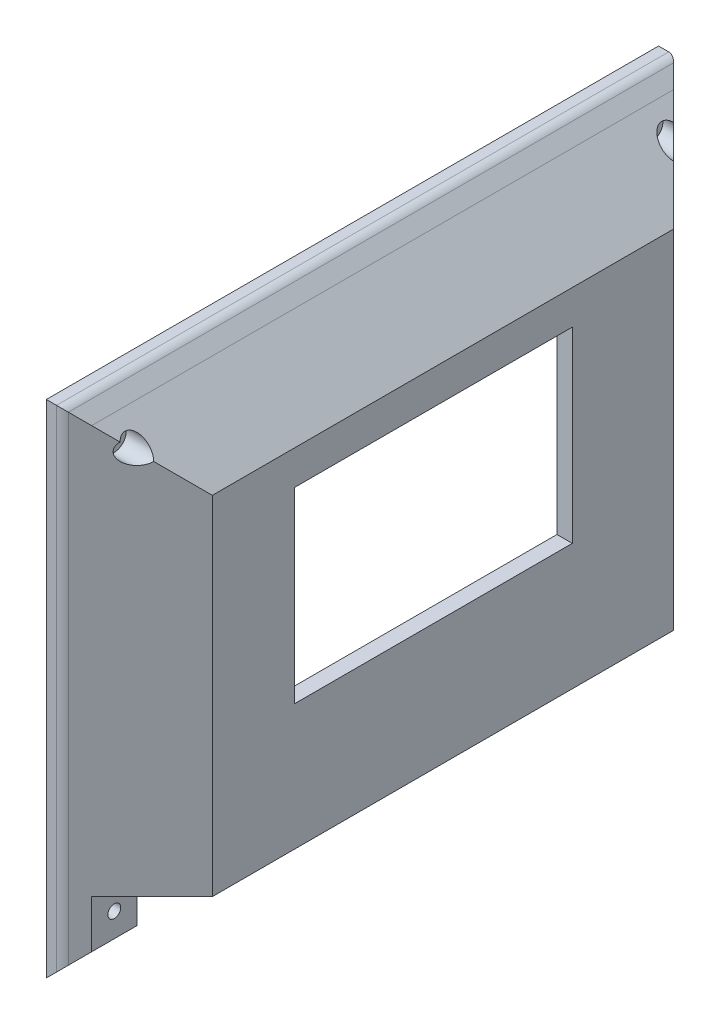
ISO-10303-21;
HEADER;
FILE_DESCRIPTION(('STEP AP214'),'2;1');
FILE_NAME('part.step','',(''),(''),'','','');
FILE_SCHEMA(('AUTOMOTIVE_DESIGN { 1 0 10303 214 1 1 1 1 }'));
ENDSEC;
DATA;
#1=APPLICATION_CONTEXT('core data for automotive mechanical design processes');
#2=APPLICATION_PROTOCOL_DEFINITION('international standard','automotive_design',2000,#1);
#3=PRODUCT_CONTEXT('',#1,'mechanical');
#4=PRODUCT('Part','Part','',(#3));
#5=PRODUCT_RELATED_PRODUCT_CATEGORY('part','',(#4));
#6=PRODUCT_DEFINITION_FORMATION('','',#4);
#7=PRODUCT_DEFINITION_CONTEXT('part definition',#1,'design');
#8=PRODUCT_DEFINITION('design','',#6,#7);
#9=PRODUCT_DEFINITION_SHAPE('','',#8);
#10=(LENGTH_UNIT() NAMED_UNIT(*) SI_UNIT(.MILLI.,.METRE.));
#11=(NAMED_UNIT(*) PLANE_ANGLE_UNIT() SI_UNIT($,.RADIAN.));
#12=(NAMED_UNIT(*) SI_UNIT($,.STERADIAN.) SOLID_ANGLE_UNIT());
#13=UNCERTAINTY_MEASURE_WITH_UNIT(LENGTH_MEASURE(1.E-05),#10,'distance_accuracy_value','');
#14=(GEOMETRIC_REPRESENTATION_CONTEXT(3) GLOBAL_UNCERTAINTY_ASSIGNED_CONTEXT((#13)) GLOBAL_UNIT_ASSIGNED_CONTEXT((#10,
#11,#12)) REPRESENTATION_CONTEXT('',''));
#15=CARTESIAN_POINT('',(0.,0.,0.));
#16=DIRECTION('',(0.,0.,1.));
#17=DIRECTION('',(1.,0.,0.));
#18=AXIS2_PLACEMENT_3D('',#15,#16,#17);
#19=CARTESIAN_POINT('',(6.35,0.,0.));
#20=DIRECTION('',(-1.,0.,0.));
#21=DIRECTION('',(0.,0.,1.));
#22=AXIS2_PLACEMENT_3D('',#19,#20,#21);
#23=PLANE('',#22);
#24=CARTESIAN_POINT('',(6.35,-34.97,-56.4625));
#25=DIRECTION('',(1.,0.,0.));
#26=DIRECTION('',(0.,0.,-1.));
#27=AXIS2_PLACEMENT_3D('',#24,#25,#26);
#28=CIRCLE('',#27,1.35);
#29=CARTESIAN_POINT('',(6.35,-34.97,-57.8125));
#30=VERTEX_POINT('',#29);
#31=EDGE_CURVE('E349',#30,#30,#28,.T.);
#32=ORIENTED_EDGE('',*,*,#31,.F.);
#33=EDGE_LOOP('',(#32));
#34=FACE_BOUND('',#33,.T.);
#35=DIRECTION('',(0.,-1.,0.));
#36=VECTOR('',#35,1.);
#37=CARTESIAN_POINT('',(6.35,46.35,-51.7));
#38=LINE('',#37,#36);
#39=CARTESIAN_POINT('',(6.35,-29.94,-51.7));
#40=VERTEX_POINT('',#39);
#41=CARTESIAN_POINT('',(6.35,-40.,-51.7));
#42=VERTEX_POINT('',#41);
#43=EDGE_CURVE('E454',#40,#42,#38,.T.);
#44=ORIENTED_EDGE('',*,*,#43,.T.);
#45=DIRECTION('',(0.,0.,-1.));
#46=VECTOR('',#45,1.);
#47=CARTESIAN_POINT('',(6.35,-40.,0.));
#48=LINE('',#47,#46);
#49=CARTESIAN_POINT('',(6.35,-40.,-61.225));
#50=VERTEX_POINT('',#49);
#51=EDGE_CURVE('E280',#42,#50,#48,.T.);
#52=ORIENTED_EDGE('',*,*,#51,.T.);
#53=DIRECTION('',(0.,1.,0.));
#54=VECTOR('',#53,1.);
#55=CARTESIAN_POINT('',(6.35,0.,-61.225));
#56=LINE('',#55,#54);
#57=CARTESIAN_POINT('',(6.35,-29.94,-61.225));
#58=VERTEX_POINT('',#57);
#59=EDGE_CURVE('E504',#50,#58,#56,.T.);
#60=ORIENTED_EDGE('',*,*,#59,.T.);
#61=DIRECTION('',(0.,0.,-1.));
#62=VECTOR('',#61,1.);
#63=CARTESIAN_POINT('',(6.35,-29.94,-51.7));
#64=LINE('',#63,#62);
#65=EDGE_CURVE('E381',#40,#58,#64,.T.);
#66=ORIENTED_EDGE('',*,*,#65,.F.);
#67=EDGE_LOOP('',(#44,#52,#60,#66));
#68=FACE_BOUND('',#67,.T.);
#69=ADVANCED_FACE('F49',(#34,#68),#23,.F.);
#70=CARTESIAN_POINT('',(6.35,-34.97,56.4625));
#71=DIRECTION('',(1.,0.,0.));
#72=DIRECTION('',(0.,0.,-1.));
#73=AXIS2_PLACEMENT_3D('',#70,#71,#72);
#74=CIRCLE('',#73,1.35);
#75=CARTESIAN_POINT('',(6.35,-34.97,55.1125));
#76=VERTEX_POINT('',#75);
#77=EDGE_CURVE('E314',#76,#76,#74,.T.);
#78=ORIENTED_EDGE('',*,*,#77,.F.);
#79=EDGE_LOOP('',(#78));
#80=FACE_BOUND('',#79,.T.);
#81=DIRECTION('',(0.,-1.,0.));
#82=VECTOR('',#81,1.);
#83=CARTESIAN_POINT('',(6.35,0.,61.225));
#84=LINE('',#83,#82);
#85=CARTESIAN_POINT('',(6.35,-29.94,61.225));
#86=VERTEX_POINT('',#85);
#87=CARTESIAN_POINT('',(6.35,-40.,61.225));
#88=VERTEX_POINT('',#87);
#89=EDGE_CURVE('E496',#86,#88,#84,.T.);
#90=ORIENTED_EDGE('',*,*,#89,.T.);
#91=DIRECTION('',(0.,0.,-1.));
#92=VECTOR('',#91,1.);
#93=CARTESIAN_POINT('',(6.35,-40.,0.));
#94=LINE('',#93,#92);
#95=CARTESIAN_POINT('',(6.35,-40.,51.7));
#96=VERTEX_POINT('',#95);
#97=EDGE_CURVE('E294',#88,#96,#94,.T.);
#98=ORIENTED_EDGE('',*,*,#97,.T.);
#99=DIRECTION('',(0.,1.,0.));
#100=VECTOR('',#99,1.);
#101=CARTESIAN_POINT('',(6.35,-46.35,51.7));
#102=LINE('',#101,#100);
#103=CARTESIAN_POINT('',(6.35,-29.94,51.7));
#104=VERTEX_POINT('',#103);
#105=EDGE_CURVE('E451',#96,#104,#102,.T.);
#106=ORIENTED_EDGE('',*,*,#105,.T.);
#107=DIRECTION('',(0.,0.,-1.));
#108=VECTOR('',#107,1.);
#109=CARTESIAN_POINT('',(6.35,-29.94,61.225));
#110=LINE('',#109,#108);
#111=EDGE_CURVE('E318',#86,#104,#110,.T.);
#112=ORIENTED_EDGE('',*,*,#111,.F.);
#113=EDGE_LOOP('',(#90,#98,#106,#112));
#114=FACE_BOUND('',#113,.T.);
#115=ADVANCED_FACE('F535',(#80,#114),#23,.F.);
#116=CARTESIAN_POINT('',(6.35,-46.35,51.7));
#117=DIRECTION('',(0.,0.,1.));
#118=DIRECTION('',(0.,-1.,0.));
#119=AXIS2_PLACEMENT_3D('',#116,#117,#118);
#120=PLANE('',#119);
#121=ORIENTED_EDGE('',*,*,#105,.F.);
#122=DIRECTION('',(0.707106781186548,0.707106781186547,0.));
#123=VECTOR('',#122,1.);
#124=CARTESIAN_POINT('',(6.35,-40.,51.7));
#125=LINE('',#124,#123);
#126=CARTESIAN_POINT('',(0.,-46.35,51.7));
#127=VERTEX_POINT('',#126);
#128=EDGE_CURVE('E298',#96,#127,#125,.F.);
#129=ORIENTED_EDGE('',*,*,#128,.T.);
#130=DIRECTION('',(0.,1.,0.));
#131=VECTOR('',#130,1.);
#132=CARTESIAN_POINT('',(0.,-46.35,51.7));
#133=LINE('',#132,#131);
#134=CARTESIAN_POINT('',(0.,-29.94,51.7));
#135=VERTEX_POINT('',#134);
#136=EDGE_CURVE('E460',#127,#135,#133,.T.);
#137=ORIENTED_EDGE('',*,*,#136,.T.);
#138=DIRECTION('',(-1.,0.,0.));
#139=VECTOR('',#138,1.);
#140=CARTESIAN_POINT('',(6.35,-29.94,51.7));
#141=LINE('',#140,#139);
#142=EDGE_CURVE('E369',#104,#135,#141,.T.);
#143=ORIENTED_EDGE('',*,*,#142,.F.);
#144=EDGE_LOOP('',(#121,#129,#137,#143));
#145=FACE_BOUND('',#144,.T.);
#146=ADVANCED_FACE('F539',(#145),#120,.F.);
#147=CARTESIAN_POINT('',(6.35,46.35,-51.7));
#148=DIRECTION('',(0.,0.,-1.));
#149=DIRECTION('',(0.,1.,0.));
#150=AXIS2_PLACEMENT_3D('',#147,#148,#149);
#151=PLANE('',#150);
#152=DIRECTION('',(0.,-1.,0.));
#153=VECTOR('',#152,1.);
#154=CARTESIAN_POINT('',(0.,46.35,-51.7));
#155=LINE('',#154,#153);
#156=CARTESIAN_POINT('',(0.,-29.94,-51.7));
#157=VERTEX_POINT('',#156);
#158=CARTESIAN_POINT('',(0.,-46.35,-51.7));
#159=VERTEX_POINT('',#158);
#160=EDGE_CURVE('E469',#157,#159,#155,.T.);
#161=ORIENTED_EDGE('',*,*,#160,.T.);
#162=DIRECTION('',(-0.707106781186548,-0.707106781186547,0.));
#163=VECTOR('',#162,1.);
#164=CARTESIAN_POINT('',(6.35,-40.,-51.7));
#165=LINE('',#164,#163);
#166=EDGE_CURVE('E291',#159,#42,#165,.F.);
#167=ORIENTED_EDGE('',*,*,#166,.T.);
#168=ORIENTED_EDGE('',*,*,#43,.F.);
#169=DIRECTION('',(1.,0.,0.));
#170=VECTOR('',#169,1.);
#171=CARTESIAN_POINT('',(0.,-29.94,-51.7));
#172=LINE('',#171,#170);
#173=EDGE_CURVE('E377',#157,#40,#172,.T.);
#174=ORIENTED_EDGE('',*,*,#173,.F.);
#175=EDGE_LOOP('',(#161,#167,#168,#174));
#176=FACE_BOUND('',#175,.T.);
#177=ADVANCED_FACE('F569',(#176),#151,.F.);
#178=CARTESIAN_POINT('',(6.35,-46.35,-64.4));
#179=DIRECTION('',(0.,0.,1.));
#180=DIRECTION('',(1.,0.,0.));
#181=AXIS2_PLACEMENT_3D('',#178,#179,#180);
#182=PLANE('',#181);
#183=DIRECTION('',(-1.,0.,0.));
#184=VECTOR('',#183,1.);
#185=CARTESIAN_POINT('',(6.35,59.05,-64.4));
#186=LINE('',#185,#184);
#187=CARTESIAN_POINT('',(2.13946609406726,59.05,-64.4));
#188=VERTEX_POINT('',#187);
#189=CARTESIAN_POINT('',(0.,59.05,-64.4));
#190=VERTEX_POINT('',#189);
#191=EDGE_CURVE('E493',#188,#190,#186,.T.);
#192=ORIENTED_EDGE('',*,*,#191,.F.);
#193=DIRECTION('',(0.,1.,0.));
#194=VECTOR('',#193,1.);
#195=CARTESIAN_POINT('',(2.13946609406726,-43.175,-64.4));
#196=LINE('',#195,#194);
#197=CARTESIAN_POINT('',(2.13946609406726,-44.2105339059327,-64.4));
#198=VERTEX_POINT('',#197);
#199=EDGE_CURVE('E334',#188,#198,#196,.F.);
#200=ORIENTED_EDGE('',*,*,#199,.T.);
#201=DIRECTION('',(0.707106781186548,0.707106781186547,0.));
#202=VECTOR('',#201,1.);
#203=CARTESIAN_POINT('',(6.35,-40.,-64.4));
#204=LINE('',#203,#202);
#205=CARTESIAN_POINT('',(0.,-46.35,-64.4));
#206=VERTEX_POINT('',#205);
#207=EDGE_CURVE('E288',#198,#206,#204,.F.);
#208=ORIENTED_EDGE('',*,*,#207,.T.);
#209=DIRECTION('',(0.,1.,0.));
#210=VECTOR('',#209,1.);
#211=CARTESIAN_POINT('',(0.,-46.35,-64.4));
#212=LINE('',#211,#210);
#213=EDGE_CURVE('E477',#206,#190,#212,.T.);
#214=ORIENTED_EDGE('',*,*,#213,.T.);
#215=EDGE_LOOP('',(#192,#200,#208,#214));
#216=FACE_BOUND('',#215,.T.);
#217=ADVANCED_FACE('F613',(#216),#182,.F.);
#218=CARTESIAN_POINT('',(6.35,59.05,64.4));
#219=DIRECTION('',(0.,-1.,0.));
#220=DIRECTION('',(0.,0.,-1.));
#221=AXIS2_PLACEMENT_3D('',#218,#219,#220);
#222=PLANE('',#221);
#223=DIRECTION('',(-1.,0.,0.));
#224=VECTOR('',#223,1.);
#225=CARTESIAN_POINT('',(6.35,59.05,64.4));
#226=LINE('',#225,#224);
#227=CARTESIAN_POINT('',(2.13946609406726,59.05,64.4));
#228=VERTEX_POINT('',#227);
#229=CARTESIAN_POINT('',(0.,59.05,64.4));
#230=VERTEX_POINT('',#229);
#231=EDGE_CURVE('E459',#228,#230,#226,.T.);
#232=ORIENTED_EDGE('',*,*,#231,.F.);
#233=DIRECTION('',(0.,0.,1.));
#234=VECTOR('',#233,1.);
#235=CARTESIAN_POINT('',(2.13946609406726,59.05,-64.4));
#236=LINE('',#235,#234);
#237=EDGE_CURVE('E328',#228,#188,#236,.F.);
#238=ORIENTED_EDGE('',*,*,#237,.T.);
#239=ORIENTED_EDGE('',*,*,#191,.T.);
#240=DIRECTION('',(0.,0.,1.));
#241=VECTOR('',#240,1.);
#242=CARTESIAN_POINT('',(0.,59.05,64.4));
#243=LINE('',#242,#241);
#244=EDGE_CURVE('E481',#190,#230,#243,.T.);
#245=ORIENTED_EDGE('',*,*,#244,.T.);
#246=EDGE_LOOP('',(#232,#238,#239,#245));
#247=FACE_BOUND('',#246,.T.);
#248=ADVANCED_FACE('F609',(#247),#222,.F.);
#249=CARTESIAN_POINT('',(6.35,-46.35,64.4));
#250=DIRECTION('',(0.,0.,-1.));
#251=DIRECTION('',(-1.,0.,0.));
#252=AXIS2_PLACEMENT_3D('',#249,#250,#251);
#253=PLANE('',#252);
#254=DIRECTION('',(-0.707106781186548,-0.707106781186547,0.));
#255=VECTOR('',#254,1.);
#256=CARTESIAN_POINT('',(6.35,-40.,64.4));
#257=LINE('',#256,#255);
#258=CARTESIAN_POINT('',(0.,-46.35,64.4));
#259=VERTEX_POINT('',#258);
#260=CARTESIAN_POINT('',(2.13946609406726,-44.2105339059327,64.4));
#261=VERTEX_POINT('',#260);
#262=EDGE_CURVE('E301',#259,#261,#257,.F.);
#263=ORIENTED_EDGE('',*,*,#262,.T.);
#264=DIRECTION('',(0.,-1.,0.));
#265=VECTOR('',#264,1.);
#266=CARTESIAN_POINT('',(2.13946609406726,59.05,64.4));
#267=LINE('',#266,#265);
#268=EDGE_CURVE('E308',#261,#228,#267,.F.);
#269=ORIENTED_EDGE('',*,*,#268,.T.);
#270=ORIENTED_EDGE('',*,*,#231,.T.);
#271=DIRECTION('',(0.,-1.,0.));
#272=VECTOR('',#271,1.);
#273=CARTESIAN_POINT('',(0.,-46.35,64.4));
#274=LINE('',#273,#272);
#275=EDGE_CURVE('E485',#230,#259,#274,.T.);
#276=ORIENTED_EDGE('',*,*,#275,.T.);
#277=EDGE_LOOP('',(#263,#269,#270,#276));
#278=FACE_BOUND('',#277,.T.);
#279=ADVANCED_FACE('F605',(#278),#253,.F.);
#280=CARTESIAN_POINT('',(0.,0.,0.));
#281=DIRECTION('',(-1.,0.,0.));
#282=DIRECTION('',(0.,0.,1.));
#283=AXIS2_PLACEMENT_3D('',#280,#281,#282);
#284=PLANE('',#283);
#285=CARTESIAN_POINT('',(0.,51.1125,56.4625));
#286=DIRECTION('',(1.,0.,0.));
#287=DIRECTION('',(0.,0.,-1.));
#288=AXIS2_PLACEMENT_3D('',#285,#286,#287);
#289=CIRCLE('',#288,1.35);
#290=CARTESIAN_POINT('',(0.,51.1125,55.1125));
#291=VERTEX_POINT('',#290);
#292=EDGE_CURVE('E786',#291,#291,#289,.T.);
#293=ORIENTED_EDGE('',*,*,#292,.T.);
#294=EDGE_LOOP('',(#293));
#295=FACE_BOUND('',#294,.T.);
#296=CARTESIAN_POINT('',(0.,51.1125,-56.4625));
#297=DIRECTION('',(1.,0.,0.));
#298=DIRECTION('',(0.,0.,-1.));
#299=AXIS2_PLACEMENT_3D('',#296,#297,#298);
#300=CIRCLE('',#299,1.35);
#301=CARTESIAN_POINT('',(0.,51.1125,-57.8125));
#302=VERTEX_POINT('',#301);
#303=EDGE_CURVE('E798',#302,#302,#300,.T.);
#304=ORIENTED_EDGE('',*,*,#303,.T.);
#305=EDGE_LOOP('',(#304));
#306=FACE_BOUND('',#305,.T.);
#307=CARTESIAN_POINT('',(0.,-34.97,56.4625));
#308=DIRECTION('',(-1.,0.,0.));
#309=DIRECTION('',(0.,0.,1.));
#310=AXIS2_PLACEMENT_3D('',#307,#308,#309);
#311=CIRCLE('',#310,1.35);
#312=CARTESIAN_POINT('',(0.,-34.97,57.8125));
#313=VERTEX_POINT('',#312);
#314=EDGE_CURVE('E313',#313,#313,#311,.T.);
#315=ORIENTED_EDGE('',*,*,#314,.F.);
#316=EDGE_LOOP('',(#315));
#317=FACE_BOUND('',#316,.T.);
#318=CARTESIAN_POINT('',(0.,-34.97,-56.4625));
#319=DIRECTION('',(-1.,0.,0.));
#320=DIRECTION('',(0.,0.,1.));
#321=AXIS2_PLACEMENT_3D('',#318,#319,#320);
#322=CIRCLE('',#321,1.35);
#323=CARTESIAN_POINT('',(0.,-34.97,-55.1125));
#324=VERTEX_POINT('',#323);
#325=EDGE_CURVE('E309',#324,#324,#322,.T.);
#326=ORIENTED_EDGE('',*,*,#325,.F.);
#327=EDGE_LOOP('',(#326));
#328=FACE_BOUND('',#327,.T.);
#329=ORIENTED_EDGE('',*,*,#136,.F.);
#330=DIRECTION('',(0.,0.,-1.));
#331=VECTOR('',#330,1.);
#332=CARTESIAN_POINT('',(0.,-46.35,64.4));
#333=LINE('',#332,#331);
#334=EDGE_CURVE('E455',#259,#127,#333,.T.);
#335=ORIENTED_EDGE('',*,*,#334,.F.);
#336=ORIENTED_EDGE('',*,*,#275,.F.);
#337=ORIENTED_EDGE('',*,*,#244,.F.);
#338=ORIENTED_EDGE('',*,*,#213,.F.);
#339=DIRECTION('',(0.,0.,-1.));
#340=VECTOR('',#339,1.);
#341=CARTESIAN_POINT('',(0.,-46.35,-51.7));
#342=LINE('',#341,#340);
#343=EDGE_CURVE('E473',#159,#206,#342,.T.);
#344=ORIENTED_EDGE('',*,*,#343,.F.);
#345=ORIENTED_EDGE('',*,*,#160,.F.);
#346=CARTESIAN_POINT('',(0.,46.35,-51.7));
#347=VERTEX_POINT('',#346);
#348=EDGE_CURVE('E470',#347,#157,#155,.T.);
#349=ORIENTED_EDGE('',*,*,#348,.F.);
#350=DIRECTION('',(0.,0.,-1.));
#351=VECTOR('',#350,1.);
#352=CARTESIAN_POINT('',(0.,46.35,51.7));
#353=LINE('',#352,#351);
#354=CARTESIAN_POINT('',(0.,46.35,51.7));
#355=VERTEX_POINT('',#354);
#356=EDGE_CURVE('E464',#355,#347,#353,.T.);
#357=ORIENTED_EDGE('',*,*,#356,.F.);
#358=EDGE_CURVE('E465',#135,#355,#133,.T.);
#359=ORIENTED_EDGE('',*,*,#358,.F.);
#360=EDGE_LOOP('',(#329,#335,#336,#337,#338,#344,#345,#349,#357,#359));
#361=FACE_BOUND('',#360,.T.);
#362=ADVANCED_FACE('F571',(#295,#306,#317,#328,#361),#284,.T.);
#363=CARTESIAN_POINT('',(6.35,0.,61.225));
#364=DIRECTION('',(-0.707106781186546,0.,-0.707106781186549));
#365=DIRECTION('',(0.,-1.,0.));
#366=AXIS2_PLACEMENT_3D('',#363,#364,#365);
#367=PLANE('',#366);
#368=DIRECTION('',(-0.577350269189628,0.577350269189625,0.577350269189625));
#369=VECTOR('',#368,1.);
#370=CARTESIAN_POINT('',(24.975,37.2500000000001,42.6000000000001));
#371=LINE('',#370,#369);
#372=CARTESIAN_POINT('',(3.90723304703362,58.3177669529664,63.6677669529664));
#373=VERTEX_POINT('',#372);
#374=CARTESIAN_POINT('',(6.35,55.875,61.225));
#375=VERTEX_POINT('',#374);
#376=EDGE_CURVE('E511',#373,#375,#371,.F.);
#377=ORIENTED_EDGE('',*,*,#376,.F.);
#378=DIRECTION('',(0.,1.,0.));
#379=VECTOR('',#378,1.);
#380=CARTESIAN_POINT('',(3.90723304703362,-43.175,63.6677669529664));
#381=LINE('',#380,#379);
#382=CARTESIAN_POINT('',(3.90723304703362,-42.4427669529664,63.6677669529664));
#383=VERTEX_POINT('',#382);
#384=EDGE_CURVE('E322',#373,#383,#381,.F.);
#385=ORIENTED_EDGE('',*,*,#384,.T.);
#386=DIRECTION('',(0.577350269189627,0.577350269189626,-0.577350269189625));
#387=VECTOR('',#386,1.);
#388=CARTESIAN_POINT('',(19.6833333333334,-26.6666666666667,47.8916666666667));
#389=LINE('',#388,#387);
#390=EDGE_CURVE('E305',#383,#88,#389,.T.);
#391=ORIENTED_EDGE('',*,*,#390,.T.);
#392=ORIENTED_EDGE('',*,*,#89,.F.);
#393=DIRECTION('',(-0.707106781186547,0.,0.707106781186548));
#394=VECTOR('',#393,1.);
#395=CARTESIAN_POINT('',(19.05,-29.94,48.525));
#396=LINE('',#395,#394);
#397=CARTESIAN_POINT('',(19.05,-29.94,48.525));
#398=VERTEX_POINT('',#397);
#399=EDGE_CURVE('E396',#398,#86,#396,.T.);
#400=ORIENTED_EDGE('',*,*,#399,.F.);
#401=DIRECTION('',(0.,-1.,0.));
#402=VECTOR('',#401,1.);
#403=CARTESIAN_POINT('',(19.05,-5.43999999999999,48.525));
#404=LINE('',#403,#402);
#405=CARTESIAN_POINT('',(19.05,43.175,48.525));
#406=VERTEX_POINT('',#405);
#407=EDGE_CURVE('E261',#406,#398,#404,.T.);
#408=ORIENTED_EDGE('',*,*,#407,.F.);
#409=DIRECTION('',(0.577350269189627,-0.577350269189625,-0.577350269189625));
#410=VECTOR('',#409,1.);
#411=CARTESIAN_POINT('',(35.225,27.,32.35));
#412=LINE('',#411,#410);
#413=CARTESIAN_POINT('',(12.8802669529663,49.3447330470336,54.6947330470336));
#414=VERTEX_POINT('',#413);
#415=EDGE_CURVE('E252',#406,#414,#412,.F.);
#416=ORIENTED_EDGE('',*,*,#415,.T.);
#417=CARTESIAN_POINT('',(11.1125,51.1125,56.4625));
#418=DIRECTION('',(-0.707106781186546,0.,-0.707106781186549));
#419=DIRECTION('',(0.707106781186549,0.,-0.707106781186546));
#420=AXIS2_PLACEMENT_3D('',#417,#418,#419);
#421=ELLIPSE('',#420,3.53553390593275,2.5);
#422=CARTESIAN_POINT('',(9.34473304703358,52.8802669529664,58.2302669529664));
#423=VERTEX_POINT('',#422);
#424=EDGE_CURVE('E63',#423,#414,#421,.F.);
#425=ORIENTED_EDGE('',*,*,#424,.F.);
#426=EDGE_CURVE('E277',#423,#375,#412,.F.);
#427=ORIENTED_EDGE('',*,*,#426,.T.);
#428=EDGE_LOOP('',(#377,#385,#391,#392,#400,#408,#416,#425,#427));
#429=FACE_BOUND('',#428,.T.);
#430=ADVANCED_FACE('F528',(#429),#367,.F.);
#431=CARTESIAN_POINT('',(6.35,55.875,0.));
#432=DIRECTION('',(-0.707106781186546,-0.707106781186549,0.));
#433=DIRECTION('',(0.,0.,1.));
#434=AXIS2_PLACEMENT_3D('',#431,#432,#433);
#435=PLANE('',#434);
#436=DIRECTION('',(-0.577350269189628,0.577350269189625,-0.577350269189625));
#437=VECTOR('',#436,1.);
#438=CARTESIAN_POINT('',(26.7583333333334,35.4666666666667,-40.8166666666667));
#439=LINE('',#438,#437);
#440=CARTESIAN_POINT('',(3.90723304703362,58.3177669529664,-63.6677669529664));
#441=VERTEX_POINT('',#440);
#442=CARTESIAN_POINT('',(6.35,55.875,-61.225));
#443=VERTEX_POINT('',#442);
#444=EDGE_CURVE('E450',#441,#443,#439,.F.);
#445=ORIENTED_EDGE('',*,*,#444,.F.);
#446=DIRECTION('',(0.,0.,-1.));
#447=VECTOR('',#446,1.);
#448=CARTESIAN_POINT('',(3.90723304703362,58.3177669529664,64.4));
#449=LINE('',#448,#447);
#450=EDGE_CURVE('E331',#441,#373,#449,.F.);
#451=ORIENTED_EDGE('',*,*,#450,.T.);
#452=ORIENTED_EDGE('',*,*,#376,.T.);
#453=DIRECTION('',(0.,0.,1.));
#454=VECTOR('',#453,1.);
#455=CARTESIAN_POINT('',(6.35,55.875,0.));
#456=LINE('',#455,#454);
#457=EDGE_CURVE('E500',#443,#375,#456,.T.);
#458=ORIENTED_EDGE('',*,*,#457,.F.);
#459=EDGE_LOOP('',(#445,#451,#452,#458));
#460=FACE_BOUND('',#459,.T.);
#461=ADVANCED_FACE('F628',(#460),#435,.F.);
#462=CARTESIAN_POINT('',(6.35,0.,-61.225));
#463=DIRECTION('',(-0.707106781186546,0.,0.707106781186549));
#464=DIRECTION('',(0.,1.,0.));
#465=AXIS2_PLACEMENT_3D('',#462,#463,#464);
#466=PLANE('',#465);
#467=DIRECTION('',(0.577350269189627,-0.577350269189625,0.577350269189625));
#468=VECTOR('',#467,1.);
#469=CARTESIAN_POINT('',(33.4416666666667,28.7833333333334,-34.1333333333334));
#470=LINE('',#469,#468);
#471=CARTESIAN_POINT('',(9.34473304703355,52.8802669529664,-58.2302669529664));
#472=VERTEX_POINT('',#471);
#473=EDGE_CURVE('E238',#472,#443,#470,.F.);
#474=ORIENTED_EDGE('',*,*,#473,.F.);
#475=CARTESIAN_POINT('',(11.1125,51.1125,-56.4625));
#476=DIRECTION('',(-0.707106781186546,0.,0.707106781186549));
#477=DIRECTION('',(0.707106781186549,0.,0.707106781186546));
#478=AXIS2_PLACEMENT_3D('',#475,#476,#477);
#479=ELLIPSE('',#478,3.53553390593275,2.5);
#480=CARTESIAN_POINT('',(12.8802669529663,49.3447330470337,-54.6947330470337));
#481=VERTEX_POINT('',#480);
#482=EDGE_CURVE('E70',#481,#472,#479,.F.);
#483=ORIENTED_EDGE('',*,*,#482,.F.);
#484=CARTESIAN_POINT('',(19.05,43.175,-48.525));
#485=VERTEX_POINT('',#484);
#486=EDGE_CURVE('E235',#485,#481,#470,.F.);
#487=ORIENTED_EDGE('',*,*,#486,.F.);
#488=DIRECTION('',(0.,1.,0.));
#489=VECTOR('',#488,1.);
#490=CARTESIAN_POINT('',(19.05,55.875,-48.525));
#491=LINE('',#490,#489);
#492=CARTESIAN_POINT('',(19.05,-29.94,-48.525));
#493=VERTEX_POINT('',#492);
#494=EDGE_CURVE('E507',#493,#485,#491,.T.);
#495=ORIENTED_EDGE('',*,*,#494,.F.);
#496=DIRECTION('',(0.707106781186547,0.,0.707106781186548));
#497=VECTOR('',#496,1.);
#498=CARTESIAN_POINT('',(6.35,-29.94,-61.225));
#499=LINE('',#498,#497);
#500=EDGE_CURVE('E385',#58,#493,#499,.T.);
#501=ORIENTED_EDGE('',*,*,#500,.F.);
#502=ORIENTED_EDGE('',*,*,#59,.F.);
#503=DIRECTION('',(-0.577350269189627,-0.577350269189626,-0.577350269189625));
#504=VECTOR('',#503,1.);
#505=CARTESIAN_POINT('',(19.6833333333334,-26.6666666666667,-47.8916666666667));
#506=LINE('',#505,#504);
#507=CARTESIAN_POINT('',(3.90723304703362,-42.4427669529664,-63.6677669529664));
#508=VERTEX_POINT('',#507);
#509=EDGE_CURVE('E284',#50,#508,#506,.T.);
#510=ORIENTED_EDGE('',*,*,#509,.T.);
#511=DIRECTION('',(0.,-1.,0.));
#512=VECTOR('',#511,1.);
#513=CARTESIAN_POINT('',(3.90723304703362,59.05,-63.6677669529664));
#514=LINE('',#513,#512);
#515=EDGE_CURVE('E231',#508,#441,#514,.F.);
#516=ORIENTED_EDGE('',*,*,#515,.T.);
#517=ORIENTED_EDGE('',*,*,#444,.T.);
#518=EDGE_LOOP('',(#474,#483,#487,#495,#501,#502,#510,#516,#517));
#519=FACE_BOUND('',#518,.T.);
#520=ADVANCED_FACE('F234',(#519),#466,.F.);
#521=CARTESIAN_POINT('',(19.05,0.,31.2));
#522=DIRECTION('',(0.,0.,1.));
#523=DIRECTION('',(1.,0.,0.));
#524=AXIS2_PLACEMENT_3D('',#521,#522,#523);
#525=PLANE('',#524);
#526=DIRECTION('',(0.,1.,0.));
#527=VECTOR('',#526,1.);
#528=CARTESIAN_POINT('',(19.05,0.,31.2));
#529=LINE('',#528,#527);
#530=CARTESIAN_POINT('',(19.05,-3.43999999999999,31.2));
#531=VERTEX_POINT('',#530);
#532=CARTESIAN_POINT('',(19.05,35.96,31.2));
#533=VERTEX_POINT('',#532);
#534=EDGE_CURVE('E250',#531,#533,#529,.T.);
#535=ORIENTED_EDGE('',*,*,#534,.F.);
#536=DIRECTION('',(1.,0.,0.));
#537=VECTOR('',#536,1.);
#538=CARTESIAN_POINT('',(-48.3111936580008,-3.43999999999999,31.2));
#539=LINE('',#538,#537);
#540=CARTESIAN_POINT('',(15.82,-3.43999999999999,31.2));
#541=VERTEX_POINT('',#540);
#542=EDGE_CURVE('E714',#541,#531,#539,.T.);
#543=ORIENTED_EDGE('',*,*,#542,.F.);
#544=DIRECTION('',(0.,1.,0.));
#545=VECTOR('',#544,1.);
#546=CARTESIAN_POINT('',(15.82,0.,31.2));
#547=LINE('',#546,#545);
#548=CARTESIAN_POINT('',(15.82,35.96,31.2));
#549=VERTEX_POINT('',#548);
#550=EDGE_CURVE('E273',#541,#549,#547,.T.);
#551=ORIENTED_EDGE('',*,*,#550,.T.);
#552=DIRECTION('',(-1.,0.,0.));
#553=VECTOR('',#552,1.);
#554=CARTESIAN_POINT('',(19.05,35.96,31.2));
#555=LINE('',#554,#553);
#556=EDGE_CURVE('E446',#533,#549,#555,.T.);
#557=ORIENTED_EDGE('',*,*,#556,.F.);
#558=EDGE_LOOP('',(#535,#543,#551,#557));
#559=FACE_BOUND('',#558,.T.);
#560=ADVANCED_FACE('F601',(#559),#525,.F.);
#561=CARTESIAN_POINT('',(19.05,35.96,0.));
#562=DIRECTION('',(0.,1.,0.));
#563=DIRECTION('',(0.,0.,1.));
#564=AXIS2_PLACEMENT_3D('',#561,#562,#563);
#565=PLANE('',#564);
#566=ORIENTED_EDGE('',*,*,#556,.T.);
#567=DIRECTION('',(0.,0.,-1.));
#568=VECTOR('',#567,1.);
#569=CARTESIAN_POINT('',(15.82,35.96,0.));
#570=LINE('',#569,#568);
#571=CARTESIAN_POINT('',(15.82,35.96,-27.2));
#572=VERTEX_POINT('',#571);
#573=EDGE_CURVE('E425',#549,#572,#570,.T.);
#574=ORIENTED_EDGE('',*,*,#573,.T.);
#575=DIRECTION('',(-1.,0.,0.));
#576=VECTOR('',#575,1.);
#577=CARTESIAN_POINT('',(19.05,35.96,-27.2));
#578=LINE('',#577,#576);
#579=CARTESIAN_POINT('',(19.05,35.96,-27.2));
#580=VERTEX_POINT('',#579);
#581=EDGE_CURVE('E441',#580,#572,#578,.T.);
#582=ORIENTED_EDGE('',*,*,#581,.F.);
#583=DIRECTION('',(0.,0.,-1.));
#584=VECTOR('',#583,1.);
#585=CARTESIAN_POINT('',(19.05,35.96,0.));
#586=LINE('',#585,#584);
#587=EDGE_CURVE('E435',#533,#580,#586,.T.);
#588=ORIENTED_EDGE('',*,*,#587,.F.);
#589=EDGE_LOOP('',(#566,#574,#582,#588));
#590=FACE_BOUND('',#589,.T.);
#591=ADVANCED_FACE('F731',(#590),#565,.F.);
#592=CARTESIAN_POINT('',(19.05,0.,-27.2));
#593=DIRECTION('',(0.,0.,1.));
#594=DIRECTION('',(0.,-1.,0.));
#595=AXIS2_PLACEMENT_3D('',#592,#593,#594);
#596=PLANE('',#595);
#597=DIRECTION('',(1.,0.,0.));
#598=VECTOR('',#597,1.);
#599=CARTESIAN_POINT('',(-48.3111936580008,-3.43999999999999,-27.2));
#600=LINE('',#599,#598);
#601=CARTESIAN_POINT('',(15.82,-3.43999999999999,-27.2));
#602=VERTEX_POINT('',#601);
#603=CARTESIAN_POINT('',(19.05,-3.43999999999999,-27.2));
#604=VERTEX_POINT('',#603);
#605=EDGE_CURVE('E709',#602,#604,#600,.T.);
#606=ORIENTED_EDGE('',*,*,#605,.T.);
#607=DIRECTION('',(0.,1.,0.));
#608=VECTOR('',#607,1.);
#609=CARTESIAN_POINT('',(19.05,0.,-27.2));
#610=LINE('',#609,#608);
#611=EDGE_CURVE('E439',#604,#580,#610,.T.);
#612=ORIENTED_EDGE('',*,*,#611,.T.);
#613=ORIENTED_EDGE('',*,*,#581,.T.);
#614=DIRECTION('',(0.,1.,0.));
#615=VECTOR('',#614,1.);
#616=CARTESIAN_POINT('',(15.82,0.,-27.2));
#617=LINE('',#616,#615);
#618=EDGE_CURVE('E267',#602,#572,#617,.T.);
#619=ORIENTED_EDGE('',*,*,#618,.F.);
#620=EDGE_LOOP('',(#606,#612,#613,#619));
#621=FACE_BOUND('',#620,.T.);
#622=ADVANCED_FACE('F723',(#621),#596,.T.);
#623=CARTESIAN_POINT('',(19.05,0.,0.));
#624=DIRECTION('',(1.,0.,0.));
#625=DIRECTION('',(0.,0.,-1.));
#626=AXIS2_PLACEMENT_3D('',#623,#624,#625);
#627=PLANE('',#626);
#628=DIRECTION('',(0.,0.,1.));
#629=VECTOR('',#628,1.);
#630=CARTESIAN_POINT('',(19.05,-3.43999999999999,31.2));
#631=LINE('',#630,#629);
#632=EDGE_CURVE('E705',#604,#531,#631,.T.);
#633=ORIENTED_EDGE('',*,*,#632,.T.);
#634=ORIENTED_EDGE('',*,*,#534,.T.);
#635=ORIENTED_EDGE('',*,*,#587,.T.);
#636=ORIENTED_EDGE('',*,*,#611,.F.);
#637=EDGE_LOOP('',(#633,#634,#635,#636));
#638=FACE_BOUND('',#637,.T.);
#639=DIRECTION('',(0.,0.,1.));
#640=VECTOR('',#639,1.);
#641=CARTESIAN_POINT('',(19.05,43.175,61.225));
#642=LINE('',#641,#640);
#643=EDGE_CURVE('E244',#485,#406,#642,.T.);
#644=ORIENTED_EDGE('',*,*,#643,.T.);
#645=ORIENTED_EDGE('',*,*,#407,.T.);
#646=DIRECTION('',(0.,0.,1.));
#647=VECTOR('',#646,1.);
#648=CARTESIAN_POINT('',(19.05,-29.94,-48.525));
#649=LINE('',#648,#647);
#650=EDGE_CURVE('E389',#493,#398,#649,.T.);
#651=ORIENTED_EDGE('',*,*,#650,.F.);
#652=ORIENTED_EDGE('',*,*,#494,.T.);
#653=EDGE_LOOP('',(#644,#645,#651,#652));
#654=FACE_BOUND('',#653,.T.);
#655=ADVANCED_FACE('F524',(#638,#654),#627,.T.);
#656=CARTESIAN_POINT('',(19.05,43.175,0.));
#657=DIRECTION('',(0.707106781186546,0.707106781186549,0.));
#658=DIRECTION('',(0.,0.,-1.));
#659=AXIS2_PLACEMENT_3D('',#656,#657,#658);
#660=PLANE('',#659);
#661=CARTESIAN_POINT('',(11.1125,51.1125,56.4625));
#662=DIRECTION('',(0.707106781186546,0.707106781186549,0.));
#663=DIRECTION('',(0.707106781186549,-0.707106781186546,0.));
#664=AXIS2_PLACEMENT_3D('',#661,#662,#663);
#665=ELLIPSE('',#664,3.53553390593275,2.5);
#666=EDGE_CURVE('E11',#414,#423,#665,.T.);
#667=ORIENTED_EDGE('',*,*,#666,.F.);
#668=ORIENTED_EDGE('',*,*,#415,.F.);
#669=ORIENTED_EDGE('',*,*,#643,.F.);
#670=ORIENTED_EDGE('',*,*,#486,.T.);
#671=CARTESIAN_POINT('',(11.1124999999999,51.1125,-56.4625));
#672=DIRECTION('',(0.707106781186546,0.707106781186549,0.));
#673=DIRECTION('',(0.707106781186549,-0.707106781186546,0.));
#674=AXIS2_PLACEMENT_3D('',#671,#672,#673);
#675=ELLIPSE('',#674,3.53553390593275,2.5);
#676=EDGE_CURVE('E58',#472,#481,#675,.T.);
#677=ORIENTED_EDGE('',*,*,#676,.F.);
#678=ORIENTED_EDGE('',*,*,#473,.T.);
#679=ORIENTED_EDGE('',*,*,#457,.T.);
#680=ORIENTED_EDGE('',*,*,#426,.F.);
#681=EDGE_LOOP('',(#667,#668,#669,#670,#677,#678,#679,#680));
#682=FACE_BOUND('',#681,.T.);
#683=ADVANCED_FACE('F242',(#682),#660,.T.);
#684=CARTESIAN_POINT('',(6.35,0.,45.35));
#685=DIRECTION('',(-0.707106781186552,0.,-0.707106781186543));
#686=DIRECTION('',(0.,-1.,0.));
#687=AXIS2_PLACEMENT_3D('',#684,#685,#686);
#688=PLANE('',#687);
#689=DIRECTION('',(0.,1.,0.));
#690=VECTOR('',#689,1.);
#691=CARTESIAN_POINT('',(6.35,46.35,45.35));
#692=LINE('',#691,#690);
#693=CARTESIAN_POINT('',(6.35,-29.94,45.35));
#694=VERTEX_POINT('',#693);
#695=CARTESIAN_POINT('',(6.35,40.,45.35));
#696=VERTEX_POINT('',#695);
#697=EDGE_CURVE('E256',#694,#696,#692,.T.);
#698=ORIENTED_EDGE('',*,*,#697,.F.);
#699=DIRECTION('',(0.707106781186547,0.,-0.707106781186548));
#700=VECTOR('',#699,1.);
#701=CARTESIAN_POINT('',(0.,-29.94,51.7));
#702=LINE('',#701,#700);
#703=EDGE_CURVE('E403',#135,#694,#702,.T.);
#704=ORIENTED_EDGE('',*,*,#703,.F.);
#705=ORIENTED_EDGE('',*,*,#358,.T.);
#706=DIRECTION('',(0.577350269189622,-0.577350269189628,-0.577350269189628));
#707=VECTOR('',#706,1.);
#708=CARTESIAN_POINT('',(21.4666666666666,24.8833333333332,30.2333333333332));
#709=LINE('',#708,#707);
#710=EDGE_CURVE('E272',#696,#355,#709,.F.);
#711=ORIENTED_EDGE('',*,*,#710,.F.);
#712=EDGE_LOOP('',(#698,#704,#705,#711));
#713=FACE_BOUND('',#712,.T.);
#714=ADVANCED_FACE('F576',(#713),#688,.T.);
#715=CARTESIAN_POINT('',(6.35,40.,0.));
#716=DIRECTION('',(-0.707106781186551,-0.707106781186544,0.));
#717=DIRECTION('',(0.,0.,1.));
#718=AXIS2_PLACEMENT_3D('',#715,#716,#717);
#719=PLANE('',#718);
#720=ORIENTED_EDGE('',*,*,#710,.T.);
#721=ORIENTED_EDGE('',*,*,#356,.T.);
#722=DIRECTION('',(0.577350269189622,-0.577350269189628,0.577350269189628));
#723=VECTOR('',#722,1.);
#724=CARTESIAN_POINT('',(19.6833333333333,26.6666666666666,-32.0166666666666));
#725=LINE('',#724,#723);
#726=CARTESIAN_POINT('',(6.35,40.,-45.35));
#727=VERTEX_POINT('',#726);
#728=EDGE_CURVE('E268',#727,#347,#725,.F.);
#729=ORIENTED_EDGE('',*,*,#728,.F.);
#730=DIRECTION('',(0.,0.,-1.));
#731=VECTOR('',#730,1.);
#732=CARTESIAN_POINT('',(6.35,40.,-51.7));
#733=LINE('',#732,#731);
#734=EDGE_CURVE('E260',#696,#727,#733,.T.);
#735=ORIENTED_EDGE('',*,*,#734,.F.);
#736=EDGE_LOOP('',(#720,#721,#729,#735));
#737=FACE_BOUND('',#736,.T.);
#738=ADVANCED_FACE('F578',(#737),#719,.T.);
#739=CARTESIAN_POINT('',(6.35,0.,-45.35));
#740=DIRECTION('',(-0.707106781186551,0.,0.707106781186544));
#741=DIRECTION('',(0.,1.,0.));
#742=AXIS2_PLACEMENT_3D('',#739,#740,#741);
#743=PLANE('',#742);
#744=ORIENTED_EDGE('',*,*,#728,.T.);
#745=ORIENTED_EDGE('',*,*,#348,.T.);
#746=DIRECTION('',(-0.707106781186547,0.,-0.707106781186548));
#747=VECTOR('',#746,1.);
#748=CARTESIAN_POINT('',(6.35,-29.94,-45.35));
#749=LINE('',#748,#747);
#750=CARTESIAN_POINT('',(6.35,-29.94,-45.35));
#751=VERTEX_POINT('',#750);
#752=EDGE_CURVE('E373',#751,#157,#749,.T.);
#753=ORIENTED_EDGE('',*,*,#752,.F.);
#754=DIRECTION('',(0.,-1.,0.));
#755=VECTOR('',#754,1.);
#756=CARTESIAN_POINT('',(6.35,-5.43999999999999,-45.35));
#757=LINE('',#756,#755);
#758=EDGE_CURVE('E264',#727,#751,#757,.T.);
#759=ORIENTED_EDGE('',*,*,#758,.F.);
#760=EDGE_LOOP('',(#744,#745,#753,#759));
#761=FACE_BOUND('',#760,.T.);
#762=ADVANCED_FACE('F563',(#761),#743,.T.);
#763=CARTESIAN_POINT('',(15.82,0.,0.));
#764=DIRECTION('',(1.,0.,0.));
#765=DIRECTION('',(0.,0.,-1.));
#766=AXIS2_PLACEMENT_3D('',#763,#764,#765);
#767=PLANE('',#766);
#768=ORIENTED_EDGE('',*,*,#550,.F.);
#769=DIRECTION('',(0.,0.,-1.));
#770=VECTOR('',#769,1.);
#771=CARTESIAN_POINT('',(15.82,-3.43999999999999,31.2));
#772=LINE('',#771,#770);
#773=EDGE_CURVE('E346',#541,#602,#772,.T.);
#774=ORIENTED_EDGE('',*,*,#773,.T.);
#775=ORIENTED_EDGE('',*,*,#618,.T.);
#776=ORIENTED_EDGE('',*,*,#573,.F.);
#777=EDGE_LOOP('',(#768,#774,#775,#776));
#778=FACE_BOUND('',#777,.T.);
#779=DIRECTION('',(0.,0.,-1.));
#780=VECTOR('',#779,1.);
#781=CARTESIAN_POINT('',(15.82,-29.94,-27.2));
#782=LINE('',#781,#780);
#783=CARTESIAN_POINT('',(15.82,-29.94,45.35));
#784=VERTEX_POINT('',#783);
#785=CARTESIAN_POINT('',(15.82,-29.94,-45.35));
#786=VERTEX_POINT('',#785);
#787=EDGE_CURVE('E364',#784,#786,#782,.T.);
#788=ORIENTED_EDGE('',*,*,#787,.F.);
#789=DIRECTION('',(0.,1.,0.));
#790=VECTOR('',#789,1.);
#791=CARTESIAN_POINT('',(15.82,-5.43999999999999,45.35));
#792=LINE('',#791,#790);
#793=CARTESIAN_POINT('',(15.82,40.,45.35));
#794=VERTEX_POINT('',#793);
#795=EDGE_CURVE('E412',#784,#794,#792,.T.);
#796=ORIENTED_EDGE('',*,*,#795,.T.);
#797=DIRECTION('',(0.,0.,-1.));
#798=VECTOR('',#797,1.);
#799=CARTESIAN_POINT('',(15.82,40.,-45.35));
#800=LINE('',#799,#798);
#801=CARTESIAN_POINT('',(15.82,40.,-45.35));
#802=VERTEX_POINT('',#801);
#803=EDGE_CURVE('E416',#794,#802,#800,.T.);
#804=ORIENTED_EDGE('',*,*,#803,.T.);
#805=DIRECTION('',(0.,-1.,0.));
#806=VECTOR('',#805,1.);
#807=CARTESIAN_POINT('',(15.82,-5.43999999999999,-45.35));
#808=LINE('',#807,#806);
#809=EDGE_CURVE('E392',#802,#786,#808,.T.);
#810=ORIENTED_EDGE('',*,*,#809,.T.);
#811=EDGE_LOOP('',(#788,#796,#804,#810));
#812=FACE_BOUND('',#811,.T.);
#813=ADVANCED_FACE('F551',(#778,#812),#767,.F.);
#814=CARTESIAN_POINT('',(15.82,-5.43999999999999,-45.35));
#815=DIRECTION('',(0.,0.,-1.));
#816=DIRECTION('',(-1.,0.,0.));
#817=AXIS2_PLACEMENT_3D('',#814,#815,#816);
#818=PLANE('',#817);
#819=ORIENTED_EDGE('',*,*,#758,.T.);
#820=DIRECTION('',(-1.,0.,0.));
#821=VECTOR('',#820,1.);
#822=CARTESIAN_POINT('',(15.82,-29.94,-45.35));
#823=LINE('',#822,#821);
#824=EDGE_CURVE('E368',#786,#751,#823,.T.);
#825=ORIENTED_EDGE('',*,*,#824,.F.);
#826=ORIENTED_EDGE('',*,*,#809,.F.);
#827=DIRECTION('',(-1.,0.,0.));
#828=VECTOR('',#827,1.);
#829=CARTESIAN_POINT('',(15.82,40.,-45.35));
#830=LINE('',#829,#828);
#831=EDGE_CURVE('E421',#802,#727,#830,.T.);
#832=ORIENTED_EDGE('',*,*,#831,.T.);
#833=EDGE_LOOP('',(#819,#825,#826,#832));
#834=FACE_BOUND('',#833,.T.);
#835=ADVANCED_FACE('F559',(#834),#818,.F.);
#836=CARTESIAN_POINT('',(15.82,40.,-45.35));
#837=DIRECTION('',(0.,1.,0.));
#838=DIRECTION('',(0.,0.,1.));
#839=AXIS2_PLACEMENT_3D('',#836,#837,#838);
#840=PLANE('',#839);
#841=ORIENTED_EDGE('',*,*,#734,.T.);
#842=ORIENTED_EDGE('',*,*,#831,.F.);
#843=ORIENTED_EDGE('',*,*,#803,.F.);
#844=DIRECTION('',(-1.,0.,0.));
#845=VECTOR('',#844,1.);
#846=CARTESIAN_POINT('',(15.82,40.,45.35));
#847=LINE('',#846,#845);
#848=EDGE_CURVE('E420',#794,#696,#847,.T.);
#849=ORIENTED_EDGE('',*,*,#848,.T.);
#850=EDGE_LOOP('',(#841,#842,#843,#849));
#851=FACE_BOUND('',#850,.T.);
#852=ADVANCED_FACE('F553',(#851),#840,.F.);
#853=CARTESIAN_POINT('',(15.82,-5.43999999999999,45.35));
#854=DIRECTION('',(0.,0.,1.));
#855=DIRECTION('',(1.,0.,0.));
#856=AXIS2_PLACEMENT_3D('',#853,#854,#855);
#857=PLANE('',#856);
#858=ORIENTED_EDGE('',*,*,#697,.T.);
#859=ORIENTED_EDGE('',*,*,#848,.F.);
#860=ORIENTED_EDGE('',*,*,#795,.F.);
#861=DIRECTION('',(1.,0.,0.));
#862=VECTOR('',#861,1.);
#863=CARTESIAN_POINT('',(6.35,-29.94,45.35));
#864=LINE('',#863,#862);
#865=EDGE_CURVE('E399',#694,#784,#864,.T.);
#866=ORIENTED_EDGE('',*,*,#865,.F.);
#867=EDGE_LOOP('',(#858,#859,#860,#866));
#868=FACE_BOUND('',#867,.T.);
#869=ADVANCED_FACE('F547',(#868),#857,.F.);
#870=CARTESIAN_POINT('',(0.,-29.94,0.));
#871=DIRECTION('',(0.,-1.,0.));
#872=DIRECTION('',(0.,0.,-1.));
#873=AXIS2_PLACEMENT_3D('',#870,#871,#872);
#874=PLANE('',#873);
#875=ORIENTED_EDGE('',*,*,#650,.T.);
#876=ORIENTED_EDGE('',*,*,#399,.T.);
#877=ORIENTED_EDGE('',*,*,#111,.T.);
#878=ORIENTED_EDGE('',*,*,#142,.T.);
#879=ORIENTED_EDGE('',*,*,#703,.T.);
#880=ORIENTED_EDGE('',*,*,#865,.T.);
#881=ORIENTED_EDGE('',*,*,#787,.T.);
#882=ORIENTED_EDGE('',*,*,#824,.T.);
#883=ORIENTED_EDGE('',*,*,#752,.T.);
#884=ORIENTED_EDGE('',*,*,#173,.T.);
#885=ORIENTED_EDGE('',*,*,#65,.T.);
#886=ORIENTED_EDGE('',*,*,#500,.T.);
#887=EDGE_LOOP('',(#875,#876,#877,#878,#879,#880,#881,#882,#883,#884,#885,#886));
#888=FACE_BOUND('',#887,.T.);
#889=ADVANCED_FACE('F532',(#888),#874,.T.);
#890=CARTESIAN_POINT('',(6.35,-40.,0.));
#891=DIRECTION('',(-0.707106781186547,0.707106781186548,0.));
#892=DIRECTION('',(0.,0.,-1.));
#893=AXIS2_PLACEMENT_3D('',#890,#891,#892);
#894=PLANE('',#893);
#895=ORIENTED_EDGE('',*,*,#207,.F.);
#896=CARTESIAN_POINT('',(2.13946609406726,-44.2105339059327,-61.9));
#897=DIRECTION('',(-0.707106781186547,0.707106781186548,0.));
#898=DIRECTION('',(-0.707106781186548,-0.707106781186547,0.));
#899=AXIS2_PLACEMENT_3D('',#896,#897,#898);
#900=ELLIPSE('',#899,3.53553390593273,2.5);
#901=EDGE_CURVE('E337',#198,#508,#900,.F.);
#902=ORIENTED_EDGE('',*,*,#901,.T.);
#903=ORIENTED_EDGE('',*,*,#509,.F.);
#904=ORIENTED_EDGE('',*,*,#51,.F.);
#905=ORIENTED_EDGE('',*,*,#166,.F.);
#906=ORIENTED_EDGE('',*,*,#343,.T.);
#907=EDGE_LOOP('',(#895,#902,#903,#904,#905,#906));
#908=FACE_BOUND('',#907,.T.);
#909=ADVANCED_FACE('F653',(#908),#894,.F.);
#910=CARTESIAN_POINT('',(6.35,-40.,0.));
#911=DIRECTION('',(-0.707106781186547,0.707106781186548,0.));
#912=DIRECTION('',(0.,0.,-1.));
#913=AXIS2_PLACEMENT_3D('',#910,#911,#912);
#914=PLANE('',#913);
#915=ORIENTED_EDGE('',*,*,#390,.F.);
#916=CARTESIAN_POINT('',(2.13946609406726,-44.2105339059327,61.9));
#917=DIRECTION('',(-0.707106781186547,0.707106781186548,0.));
#918=DIRECTION('',(0.707106781186548,0.707106781186547,0.));
#919=AXIS2_PLACEMENT_3D('',#916,#917,#918);
#920=ELLIPSE('',#919,3.53553390593273,2.5);
#921=EDGE_CURVE('E325',#383,#261,#920,.F.);
#922=ORIENTED_EDGE('',*,*,#921,.T.);
#923=ORIENTED_EDGE('',*,*,#262,.F.);
#924=ORIENTED_EDGE('',*,*,#334,.T.);
#925=ORIENTED_EDGE('',*,*,#128,.F.);
#926=ORIENTED_EDGE('',*,*,#97,.F.);
#927=EDGE_LOOP('',(#915,#922,#923,#924,#925,#926));
#928=FACE_BOUND('',#927,.T.);
#929=ADVANCED_FACE('F657',(#928),#914,.F.);
#930=CARTESIAN_POINT('',(-18.15,-34.97,-56.4625));
#931=DIRECTION('',(1.,0.,0.));
#932=DIRECTION('',(0.,0.,-1.));
#933=AXIS2_PLACEMENT_3D('',#930,#931,#932);
#934=CYLINDRICAL_SURFACE('',#933,1.35);
#935=ORIENTED_EDGE('',*,*,#325,.T.);
#936=EDGE_LOOP('',(#935));
#937=FACE_BOUND('',#936,.T.);
#938=ORIENTED_EDGE('',*,*,#31,.T.);
#939=EDGE_LOOP('',(#938));
#940=FACE_BOUND('',#939,.T.);
#941=ADVANCED_FACE('F660',(#937,#940),#934,.F.);
#942=CARTESIAN_POINT('',(-18.15,-34.97,56.4625));
#943=DIRECTION('',(1.,0.,0.));
#944=DIRECTION('',(0.,0.,-1.));
#945=AXIS2_PLACEMENT_3D('',#942,#943,#944);
#946=CYLINDRICAL_SURFACE('',#945,1.35);
#947=ORIENTED_EDGE('',*,*,#314,.T.);
#948=EDGE_LOOP('',(#947));
#949=FACE_BOUND('',#948,.T.);
#950=ORIENTED_EDGE('',*,*,#77,.T.);
#951=EDGE_LOOP('',(#950));
#952=FACE_BOUND('',#951,.T.);
#953=ADVANCED_FACE('F671',(#949,#952),#946,.F.);
#954=CARTESIAN_POINT('',(2.13946609406726,-46.35,-61.9));
#955=DIRECTION('',(0.,-1.,0.));
#956=DIRECTION('',(0.,0.,-1.));
#957=AXIS2_PLACEMENT_3D('',#954,#955,#956);
#958=CYLINDRICAL_SURFACE('',#957,2.5);
#959=ORIENTED_EDGE('',*,*,#901,.F.);
#960=ORIENTED_EDGE('',*,*,#199,.F.);
#961=CARTESIAN_POINT('',(2.13946609406726,56.55,-61.9));
#962=DIRECTION('',(0.,-0.707106781186547,-0.707106781186547));
#963=DIRECTION('',(0.,-0.707106781186547,0.707106781186547));
#964=AXIS2_PLACEMENT_3D('',#961,#962,#963);
#965=ELLIPSE('',#964,3.53553390593274,2.5);
#966=EDGE_CURVE('E345',#441,#188,#965,.F.);
#967=ORIENTED_EDGE('',*,*,#966,.F.);
#968=ORIENTED_EDGE('',*,*,#515,.F.);
#969=EDGE_LOOP('',(#959,#960,#967,#968));
#970=FACE_BOUND('',#969,.T.);
#971=ADVANCED_FACE('F51',(#970),#958,.T.);
#972=CARTESIAN_POINT('',(2.13946609406726,56.55,64.4));
#973=DIRECTION('',(0.,0.,-1.));
#974=DIRECTION('',(-1.,0.,0.));
#975=AXIS2_PLACEMENT_3D('',#972,#973,#974);
#976=CYLINDRICAL_SURFACE('',#975,2.5);
#977=ORIENTED_EDGE('',*,*,#966,.T.);
#978=ORIENTED_EDGE('',*,*,#237,.F.);
#979=CARTESIAN_POINT('',(2.13946609406726,56.55,61.9));
#980=DIRECTION('',(0.,0.707106781186547,-0.707106781186547));
#981=DIRECTION('',(0.,-0.707106781186547,-0.707106781186547));
#982=AXIS2_PLACEMENT_3D('',#979,#980,#981);
#983=ELLIPSE('',#982,3.53553390593274,2.5);
#984=EDGE_CURVE('E342',#373,#228,#983,.F.);
#985=ORIENTED_EDGE('',*,*,#984,.F.);
#986=ORIENTED_EDGE('',*,*,#450,.F.);
#987=EDGE_LOOP('',(#977,#978,#985,#986));
#988=FACE_BOUND('',#987,.T.);
#989=ADVANCED_FACE('F665',(#988),#976,.T.);
#990=CARTESIAN_POINT('',(2.13946609406726,-46.35,61.9));
#991=DIRECTION('',(0.,1.,0.));
#992=DIRECTION('',(0.,0.,1.));
#993=AXIS2_PLACEMENT_3D('',#990,#991,#992);
#994=CYLINDRICAL_SURFACE('',#993,2.5);
#995=ORIENTED_EDGE('',*,*,#921,.F.);
#996=ORIENTED_EDGE('',*,*,#384,.F.);
#997=ORIENTED_EDGE('',*,*,#984,.T.);
#998=ORIENTED_EDGE('',*,*,#268,.F.);
#999=EDGE_LOOP('',(#995,#996,#997,#998));
#1000=FACE_BOUND('',#999,.T.);
#1001=ADVANCED_FACE('F662',(#1000),#994,.T.);
#1002=CARTESIAN_POINT('',(-48.3111936580008,-3.43999999999999,31.2));
#1003=DIRECTION('',(0.,1.,0.));
#1004=DIRECTION('',(0.,0.,1.));
#1005=AXIS2_PLACEMENT_3D('',#1002,#1003,#1004);
#1006=PLANE('',#1005);
#1007=ORIENTED_EDGE('',*,*,#773,.F.);
#1008=ORIENTED_EDGE('',*,*,#542,.T.);
#1009=ORIENTED_EDGE('',*,*,#632,.F.);
#1010=ORIENTED_EDGE('',*,*,#605,.F.);
#1011=EDGE_LOOP('',(#1007,#1008,#1009,#1010));
#1012=FACE_BOUND('',#1011,.T.);
#1013=ADVANCED_FACE('F664',(#1012),#1006,.T.);
#1014=CARTESIAN_POINT('',(6.35,0.,0.));
#1015=DIRECTION('',(-1.,0.,0.));
#1016=DIRECTION('',(0.,0.,1.));
#1017=AXIS2_PLACEMENT_3D('',#1014,#1015,#1016);
#1018=PLANE('',#1017);
#1019=CARTESIAN_POINT('',(6.35,51.1125,-56.4625));
#1020=DIRECTION('',(1.,0.,0.));
#1021=DIRECTION('',(0.,0.,-1.));
#1022=AXIS2_PLACEMENT_3D('',#1019,#1020,#1021);
#1023=CIRCLE('',#1022,1.35);
#1024=CARTESIAN_POINT('',(6.35,51.1125,-57.8125));
#1025=VERTEX_POINT('',#1024);
#1026=EDGE_CURVE('E791',#1025,#1025,#1023,.T.);
#1027=ORIENTED_EDGE('',*,*,#1026,.F.);
#1028=EDGE_LOOP('',(#1027));
#1029=FACE_BOUND('',#1028,.T.);
#1030=CARTESIAN_POINT('',(6.35,51.1125,-56.4625));
#1031=DIRECTION('',(-1.,0.,0.));
#1032=DIRECTION('',(0.,0.,1.));
#1033=AXIS2_PLACEMENT_3D('',#1030,#1031,#1032);
#1034=CIRCLE('',#1033,2.5);
#1035=CARTESIAN_POINT('',(6.35,51.1125,-53.9625));
#1036=VERTEX_POINT('',#1035);
#1037=EDGE_CURVE('E795',#1036,#1036,#1034,.F.);
#1038=ORIENTED_EDGE('',*,*,#1037,.T.);
#1039=EDGE_LOOP('',(#1038));
#1040=FACE_BOUND('',#1039,.T.);
#1041=ADVANCED_FACE('F761',(#1029,#1040),#1018,.F.);
#1042=CARTESIAN_POINT('',(-0.721067811865483,51.1125,-56.4625));
#1043=DIRECTION('',(1.,0.,0.));
#1044=DIRECTION('',(0.,0.,-1.));
#1045=AXIS2_PLACEMENT_3D('',#1042,#1043,#1044);
#1046=CYLINDRICAL_SURFACE('',#1045,2.5);
#1047=ORIENTED_EDGE('',*,*,#482,.T.);
#1048=ORIENTED_EDGE('',*,*,#676,.T.);
#1049=EDGE_LOOP('',(#1047,#1048));
#1050=FACE_BOUND('',#1049,.T.);
#1051=ORIENTED_EDGE('',*,*,#1037,.F.);
#1052=EDGE_LOOP('',(#1051));
#1053=FACE_BOUND('',#1052,.T.);
#1054=ADVANCED_FACE('F225',(#1050,#1053),#1046,.F.);
#1055=CARTESIAN_POINT('',(6.35,0.,0.));
#1056=DIRECTION('',(-1.,0.,0.));
#1057=DIRECTION('',(0.,0.,1.));
#1058=AXIS2_PLACEMENT_3D('',#1055,#1056,#1057);
#1059=PLANE('',#1058);
#1060=CARTESIAN_POINT('',(6.35,51.1125,56.4625));
#1061=DIRECTION('',(1.,0.,0.));
#1062=DIRECTION('',(0.,0.,-1.));
#1063=AXIS2_PLACEMENT_3D('',#1060,#1061,#1062);
#1064=CIRCLE('',#1063,1.35);
#1065=CARTESIAN_POINT('',(6.35,51.1125,55.1125));
#1066=VERTEX_POINT('',#1065);
#1067=EDGE_CURVE('E789',#1066,#1066,#1064,.T.);
#1068=ORIENTED_EDGE('',*,*,#1067,.F.);
#1069=EDGE_LOOP('',(#1068));
#1070=FACE_BOUND('',#1069,.T.);
#1071=CARTESIAN_POINT('',(6.35,51.1125,56.4625));
#1072=DIRECTION('',(-1.,0.,0.));
#1073=DIRECTION('',(0.,0.,1.));
#1074=AXIS2_PLACEMENT_3D('',#1071,#1072,#1073);
#1075=CIRCLE('',#1074,2.5);
#1076=CARTESIAN_POINT('',(6.35,51.1125,58.9625));
#1077=VERTEX_POINT('',#1076);
#1078=EDGE_CURVE('E240',#1077,#1077,#1075,.F.);
#1079=ORIENTED_EDGE('',*,*,#1078,.T.);
#1080=EDGE_LOOP('',(#1079));
#1081=FACE_BOUND('',#1080,.T.);
#1082=ADVANCED_FACE('F764',(#1070,#1081),#1059,.F.);
#1083=CARTESIAN_POINT('',(-0.721067811865483,51.1125,56.4625));
#1084=DIRECTION('',(1.,0.,0.));
#1085=DIRECTION('',(0.,0.,-1.));
#1086=AXIS2_PLACEMENT_3D('',#1083,#1084,#1085);
#1087=CYLINDRICAL_SURFACE('',#1086,2.5);
#1088=ORIENTED_EDGE('',*,*,#424,.T.);
#1089=ORIENTED_EDGE('',*,*,#666,.T.);
#1090=EDGE_LOOP('',(#1088,#1089));
#1091=FACE_BOUND('',#1090,.T.);
#1092=ORIENTED_EDGE('',*,*,#1078,.F.);
#1093=EDGE_LOOP('',(#1092));
#1094=FACE_BOUND('',#1093,.T.);
#1095=ADVANCED_FACE('F770',(#1091,#1094),#1087,.F.);
#1096=CARTESIAN_POINT('',(0.,51.1125,-56.4625));
#1097=DIRECTION('',(1.,0.,0.));
#1098=DIRECTION('',(0.,0.,-1.));
#1099=AXIS2_PLACEMENT_3D('',#1096,#1097,#1098);
#1100=CYLINDRICAL_SURFACE('',#1099,1.35);
#1101=ORIENTED_EDGE('',*,*,#303,.F.);
#1102=EDGE_LOOP('',(#1101));
#1103=FACE_BOUND('',#1102,.T.);
#1104=ORIENTED_EDGE('',*,*,#1026,.T.);
#1105=EDGE_LOOP('',(#1104));
#1106=FACE_BOUND('',#1105,.T.);
#1107=ADVANCED_FACE('F774',(#1103,#1106),#1100,.F.);
#1108=CARTESIAN_POINT('',(0.,51.1125,56.4625));
#1109=DIRECTION('',(1.,0.,0.));
#1110=DIRECTION('',(0.,0.,-1.));
#1111=AXIS2_PLACEMENT_3D('',#1108,#1109,#1110);
#1112=CYLINDRICAL_SURFACE('',#1111,1.35);
#1113=ORIENTED_EDGE('',*,*,#292,.F.);
#1114=EDGE_LOOP('',(#1113));
#1115=FACE_BOUND('',#1114,.T.);
#1116=ORIENTED_EDGE('',*,*,#1067,.T.);
#1117=EDGE_LOOP('',(#1116));
#1118=FACE_BOUND('',#1117,.T.);
#1119=ADVANCED_FACE('F777',(#1115,#1118),#1112,.F.);
#1120=CLOSED_SHELL('',(#69,#115,#146,#177,#217,#248,#279,#362,#430,#461,#520,#560,#591,#622,
#655,#683,#714,#738,#762,#813,#835,#852,#869,#889,#909,#929,#941,#953,#971,#989,#1001,#1013,
#1041,#1054,#1082,#1095,#1107,#1119));
#1121=MANIFOLD_SOLID_BREP('B2',#1120);
#1122=ADVANCED_BREP_SHAPE_REPRESENTATION('',(#18,#1121),#14);
#1123=SHAPE_DEFINITION_REPRESENTATION(#9,#1122);
ENDSEC;
END-ISO-10303-21;
